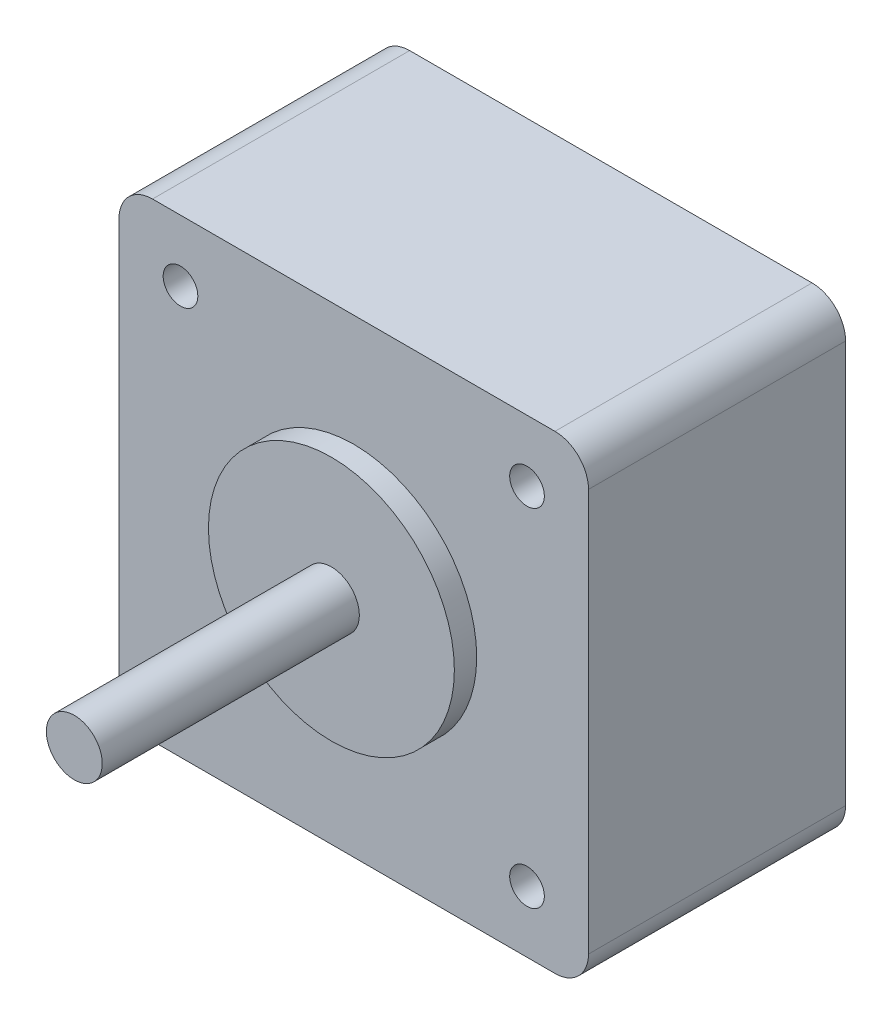
ISO-10303-21;
HEADER;
FILE_DESCRIPTION(('STEP AP214'),'2;1');
FILE_NAME('part.step','',(''),(''),'','','');
FILE_SCHEMA(('AUTOMOTIVE_DESIGN { 1 0 10303 214 1 1 1 1 }'));
ENDSEC;
DATA;
#1=APPLICATION_CONTEXT('core data for automotive mechanical design processes');
#2=APPLICATION_PROTOCOL_DEFINITION('international standard','automotive_design',2000,#1);
#3=PRODUCT_CONTEXT('',#1,'mechanical');
#4=PRODUCT('Part','Part','',(#3));
#5=PRODUCT_RELATED_PRODUCT_CATEGORY('part','',(#4));
#6=PRODUCT_DEFINITION_FORMATION('','',#4);
#7=PRODUCT_DEFINITION_CONTEXT('part definition',#1,'design');
#8=PRODUCT_DEFINITION('design','',#6,#7);
#9=PRODUCT_DEFINITION_SHAPE('','',#8);
#10=(LENGTH_UNIT() NAMED_UNIT(*) SI_UNIT(.MILLI.,.METRE.));
#11=(NAMED_UNIT(*) PLANE_ANGLE_UNIT() SI_UNIT($,.RADIAN.));
#12=(NAMED_UNIT(*) SI_UNIT($,.STERADIAN.) SOLID_ANGLE_UNIT());
#13=UNCERTAINTY_MEASURE_WITH_UNIT(LENGTH_MEASURE(1.E-05),#10,'distance_accuracy_value','');
#14=(GEOMETRIC_REPRESENTATION_CONTEXT(3) GLOBAL_UNCERTAINTY_ASSIGNED_CONTEXT((#13)) GLOBAL_UNIT_ASSIGNED_CONTEXT((#10,
#11,#12)) REPRESENTATION_CONTEXT('',''));
#15=CARTESIAN_POINT('',(0.,0.,0.));
#16=DIRECTION('',(0.,0.,1.));
#17=DIRECTION('',(1.,0.,0.));
#18=AXIS2_PLACEMENT_3D('',#15,#16,#17);
#19=CARTESIAN_POINT('',(-18.,-18.,23.));
#20=DIRECTION('',(0.,0.,-1.));
#21=DIRECTION('',(-1.,0.,0.));
#22=AXIS2_PLACEMENT_3D('',#19,#20,#21);
#23=CYLINDRICAL_SURFACE('',#22,3.);
#24=CARTESIAN_POINT('',(-18.,-18.,0.));
#25=DIRECTION('',(0.,0.,1.));
#26=DIRECTION('',(-1.,0.,0.));
#27=AXIS2_PLACEMENT_3D('',#24,#25,#26);
#28=CIRCLE('',#27,3.);
#29=CARTESIAN_POINT('',(-21.,-18.,0.));
#30=VERTEX_POINT('',#29);
#31=CARTESIAN_POINT('',(-18.,-21.,0.));
#32=VERTEX_POINT('',#31);
#33=EDGE_CURVE('E143',#30,#32,#28,.T.);
#34=ORIENTED_EDGE('',*,*,#33,.T.);
#35=DIRECTION('',(0.,0.,-1.));
#36=VECTOR('',#35,1.);
#37=CARTESIAN_POINT('',(-18.,-21.,23.));
#38=LINE('',#37,#36);
#39=CARTESIAN_POINT('',(-18.,-21.,23.));
#40=VERTEX_POINT('',#39);
#41=EDGE_CURVE('E42',#40,#32,#38,.T.);
#42=ORIENTED_EDGE('',*,*,#41,.F.);
#43=CARTESIAN_POINT('',(-18.,-18.,23.));
#44=DIRECTION('',(0.,0.,1.));
#45=DIRECTION('',(-1.,0.,0.));
#46=AXIS2_PLACEMENT_3D('',#43,#44,#45);
#47=CIRCLE('',#46,3.);
#48=CARTESIAN_POINT('',(-21.,-18.,23.));
#49=VERTEX_POINT('',#48);
#50=EDGE_CURVE('E166',#49,#40,#47,.T.);
#51=ORIENTED_EDGE('',*,*,#50,.F.);
#52=DIRECTION('',(0.,0.,-1.));
#53=VECTOR('',#52,1.);
#54=CARTESIAN_POINT('',(-21.,-18.,23.));
#55=LINE('',#54,#53);
#56=EDGE_CURVE('E139',#49,#30,#55,.T.);
#57=ORIENTED_EDGE('',*,*,#56,.T.);
#58=EDGE_LOOP('',(#34,#42,#51,#57));
#59=FACE_BOUND('',#58,.T.);
#60=ADVANCED_FACE('F39',(#59),#23,.T.);
#61=CARTESIAN_POINT('',(-18.,-21.,23.));
#62=DIRECTION('',(0.,1.,0.));
#63=DIRECTION('',(0.,0.,1.));
#64=AXIS2_PLACEMENT_3D('',#61,#62,#63);
#65=PLANE('',#64);
#66=DIRECTION('',(1.,0.,0.));
#67=VECTOR('',#66,1.);
#68=CARTESIAN_POINT('',(-18.,-21.,0.));
#69=LINE('',#68,#67);
#70=CARTESIAN_POINT('',(18.,-21.,0.));
#71=VERTEX_POINT('',#70);
#72=EDGE_CURVE('E147',#32,#71,#69,.T.);
#73=ORIENTED_EDGE('',*,*,#72,.T.);
#74=DIRECTION('',(0.,0.,-1.));
#75=VECTOR('',#74,1.);
#76=CARTESIAN_POINT('',(18.,-21.,23.));
#77=LINE('',#76,#75);
#78=CARTESIAN_POINT('',(18.,-21.,23.));
#79=VERTEX_POINT('',#78);
#80=EDGE_CURVE('E180',#79,#71,#77,.T.);
#81=ORIENTED_EDGE('',*,*,#80,.F.);
#82=DIRECTION('',(1.,0.,0.));
#83=VECTOR('',#82,1.);
#84=CARTESIAN_POINT('',(-18.,-21.,23.));
#85=LINE('',#84,#83);
#86=EDGE_CURVE('E102',#40,#79,#85,.T.);
#87=ORIENTED_EDGE('',*,*,#86,.F.);
#88=ORIENTED_EDGE('',*,*,#41,.T.);
#89=EDGE_LOOP('',(#73,#81,#87,#88));
#90=FACE_BOUND('',#89,.T.);
#91=ADVANCED_FACE('F277',(#90),#65,.F.);
#92=CARTESIAN_POINT('',(18.,-18.,23.));
#93=DIRECTION('',(0.,0.,-1.));
#94=DIRECTION('',(-1.,0.,0.));
#95=AXIS2_PLACEMENT_3D('',#92,#93,#94);
#96=CYLINDRICAL_SURFACE('',#95,3.);
#97=CARTESIAN_POINT('',(18.,-18.,0.));
#98=DIRECTION('',(0.,0.,1.));
#99=DIRECTION('',(-1.,0.,0.));
#100=AXIS2_PLACEMENT_3D('',#97,#98,#99);
#101=CIRCLE('',#100,3.);
#102=CARTESIAN_POINT('',(21.,-18.,0.));
#103=VERTEX_POINT('',#102);
#104=EDGE_CURVE('E151',#71,#103,#101,.T.);
#105=ORIENTED_EDGE('',*,*,#104,.T.);
#106=DIRECTION('',(0.,0.,-1.));
#107=VECTOR('',#106,1.);
#108=CARTESIAN_POINT('',(21.,-18.,23.));
#109=LINE('',#108,#107);
#110=CARTESIAN_POINT('',(21.,-18.,23.));
#111=VERTEX_POINT('',#110);
#112=EDGE_CURVE('E177',#111,#103,#109,.T.);
#113=ORIENTED_EDGE('',*,*,#112,.F.);
#114=CARTESIAN_POINT('',(18.,-18.,23.));
#115=DIRECTION('',(0.,0.,1.));
#116=DIRECTION('',(-1.,0.,0.));
#117=AXIS2_PLACEMENT_3D('',#114,#115,#116);
#118=CIRCLE('',#117,3.);
#119=EDGE_CURVE('E199',#79,#111,#118,.T.);
#120=ORIENTED_EDGE('',*,*,#119,.F.);
#121=ORIENTED_EDGE('',*,*,#80,.T.);
#122=EDGE_LOOP('',(#105,#113,#120,#121));
#123=FACE_BOUND('',#122,.T.);
#124=ADVANCED_FACE('F282',(#123),#96,.T.);
#125=CARTESIAN_POINT('',(21.,18.,23.));
#126=DIRECTION('',(-1.,0.,0.));
#127=DIRECTION('',(0.,0.,1.));
#128=AXIS2_PLACEMENT_3D('',#125,#126,#127);
#129=PLANE('',#128);
#130=DIRECTION('',(0.,1.,0.));
#131=VECTOR('',#130,1.);
#132=CARTESIAN_POINT('',(21.,18.,0.));
#133=LINE('',#132,#131);
#134=CARTESIAN_POINT('',(21.,18.,0.));
#135=VERTEX_POINT('',#134);
#136=EDGE_CURVE('E154',#103,#135,#133,.T.);
#137=ORIENTED_EDGE('',*,*,#136,.T.);
#138=DIRECTION('',(0.,0.,-1.));
#139=VECTOR('',#138,1.);
#140=CARTESIAN_POINT('',(21.,18.,23.));
#141=LINE('',#140,#139);
#142=CARTESIAN_POINT('',(21.,18.,23.));
#143=VERTEX_POINT('',#142);
#144=EDGE_CURVE('E173',#143,#135,#141,.T.);
#145=ORIENTED_EDGE('',*,*,#144,.F.);
#146=DIRECTION('',(0.,1.,0.));
#147=VECTOR('',#146,1.);
#148=CARTESIAN_POINT('',(21.,18.,23.));
#149=LINE('',#148,#147);
#150=EDGE_CURVE('E202',#111,#143,#149,.T.);
#151=ORIENTED_EDGE('',*,*,#150,.F.);
#152=ORIENTED_EDGE('',*,*,#112,.T.);
#153=EDGE_LOOP('',(#137,#145,#151,#152));
#154=FACE_BOUND('',#153,.T.);
#155=ADVANCED_FACE('F291',(#154),#129,.F.);
#156=CARTESIAN_POINT('',(18.,18.,23.));
#157=DIRECTION('',(0.,0.,-1.));
#158=DIRECTION('',(-1.,0.,0.));
#159=AXIS2_PLACEMENT_3D('',#156,#157,#158);
#160=CYLINDRICAL_SURFACE('',#159,3.);
#161=CARTESIAN_POINT('',(18.,18.,0.));
#162=DIRECTION('',(0.,0.,1.));
#163=DIRECTION('',(-1.,0.,0.));
#164=AXIS2_PLACEMENT_3D('',#161,#162,#163);
#165=CIRCLE('',#164,3.);
#166=CARTESIAN_POINT('',(18.,21.,0.));
#167=VERTEX_POINT('',#166);
#168=EDGE_CURVE('E157',#135,#167,#165,.T.);
#169=ORIENTED_EDGE('',*,*,#168,.T.);
#170=DIRECTION('',(0.,0.,-1.));
#171=VECTOR('',#170,1.);
#172=CARTESIAN_POINT('',(18.,21.,23.));
#173=LINE('',#172,#171);
#174=CARTESIAN_POINT('',(18.,21.,23.));
#175=VERTEX_POINT('',#174);
#176=EDGE_CURVE('E132',#175,#167,#173,.T.);
#177=ORIENTED_EDGE('',*,*,#176,.F.);
#178=CARTESIAN_POINT('',(18.,18.,23.));
#179=DIRECTION('',(0.,0.,1.));
#180=DIRECTION('',(-1.,0.,0.));
#181=AXIS2_PLACEMENT_3D('',#178,#179,#180);
#182=CIRCLE('',#181,3.);
#183=EDGE_CURVE('E121',#143,#175,#182,.T.);
#184=ORIENTED_EDGE('',*,*,#183,.F.);
#185=ORIENTED_EDGE('',*,*,#144,.T.);
#186=EDGE_LOOP('',(#169,#177,#184,#185));
#187=FACE_BOUND('',#186,.T.);
#188=ADVANCED_FACE('F294',(#187),#160,.T.);
#189=CARTESIAN_POINT('',(-18.,21.,23.));
#190=DIRECTION('',(0.,-1.,0.));
#191=DIRECTION('',(0.,0.,-1.));
#192=AXIS2_PLACEMENT_3D('',#189,#190,#191);
#193=PLANE('',#192);
#194=DIRECTION('',(-1.,0.,0.));
#195=VECTOR('',#194,1.);
#196=CARTESIAN_POINT('',(-18.,21.,0.));
#197=LINE('',#196,#195);
#198=CARTESIAN_POINT('',(-18.,21.,0.));
#199=VERTEX_POINT('',#198);
#200=EDGE_CURVE('E130',#167,#199,#197,.T.);
#201=ORIENTED_EDGE('',*,*,#200,.T.);
#202=DIRECTION('',(0.,0.,-1.));
#203=VECTOR('',#202,1.);
#204=CARTESIAN_POINT('',(-18.,21.,23.));
#205=LINE('',#204,#203);
#206=CARTESIAN_POINT('',(-18.,21.,23.));
#207=VERTEX_POINT('',#206);
#208=EDGE_CURVE('E127',#207,#199,#205,.T.);
#209=ORIENTED_EDGE('',*,*,#208,.F.);
#210=DIRECTION('',(-1.,0.,0.));
#211=VECTOR('',#210,1.);
#212=CARTESIAN_POINT('',(-18.,21.,23.));
#213=LINE('',#212,#211);
#214=EDGE_CURVE('E115',#175,#207,#213,.T.);
#215=ORIENTED_EDGE('',*,*,#214,.F.);
#216=ORIENTED_EDGE('',*,*,#176,.T.);
#217=EDGE_LOOP('',(#201,#209,#215,#216));
#218=FACE_BOUND('',#217,.T.);
#219=ADVANCED_FACE('F128',(#218),#193,.F.);
#220=CARTESIAN_POINT('',(-18.,18.,23.));
#221=DIRECTION('',(0.,0.,-1.));
#222=DIRECTION('',(-1.,0.,0.));
#223=AXIS2_PLACEMENT_3D('',#220,#221,#222);
#224=CYLINDRICAL_SURFACE('',#223,3.);
#225=CARTESIAN_POINT('',(-18.,18.,0.));
#226=DIRECTION('',(0.,0.,1.));
#227=DIRECTION('',(-1.,0.,0.));
#228=AXIS2_PLACEMENT_3D('',#225,#226,#227);
#229=CIRCLE('',#228,3.);
#230=CARTESIAN_POINT('',(-21.,18.,0.));
#231=VERTEX_POINT('',#230);
#232=EDGE_CURVE('E87',#199,#231,#229,.T.);
#233=ORIENTED_EDGE('',*,*,#232,.T.);
#234=DIRECTION('',(0.,0.,-1.));
#235=VECTOR('',#234,1.);
#236=CARTESIAN_POINT('',(-21.,18.,23.));
#237=LINE('',#236,#235);
#238=CARTESIAN_POINT('',(-21.,18.,23.));
#239=VERTEX_POINT('',#238);
#240=EDGE_CURVE('E133',#239,#231,#237,.T.);
#241=ORIENTED_EDGE('',*,*,#240,.F.);
#242=CARTESIAN_POINT('',(-18.,18.,23.));
#243=DIRECTION('',(0.,0.,1.));
#244=DIRECTION('',(-1.,0.,0.));
#245=AXIS2_PLACEMENT_3D('',#242,#243,#244);
#246=CIRCLE('',#245,3.);
#247=EDGE_CURVE('E119',#207,#239,#246,.T.);
#248=ORIENTED_EDGE('',*,*,#247,.F.);
#249=ORIENTED_EDGE('',*,*,#208,.T.);
#250=EDGE_LOOP('',(#233,#241,#248,#249));
#251=FACE_BOUND('',#250,.T.);
#252=ADVANCED_FACE('F135',(#251),#224,.T.);
#253=CARTESIAN_POINT('',(-21.,18.,23.));
#254=DIRECTION('',(1.,0.,0.));
#255=DIRECTION('',(0.,1.,0.));
#256=AXIS2_PLACEMENT_3D('',#253,#254,#255);
#257=PLANE('',#256);
#258=DIRECTION('',(0.,-1.,0.));
#259=VECTOR('',#258,1.);
#260=CARTESIAN_POINT('',(-21.,18.,0.));
#261=LINE('',#260,#259);
#262=EDGE_CURVE('E93',#231,#30,#261,.T.);
#263=ORIENTED_EDGE('',*,*,#262,.T.);
#264=ORIENTED_EDGE('',*,*,#56,.F.);
#265=DIRECTION('',(0.,-1.,0.));
#266=VECTOR('',#265,1.);
#267=CARTESIAN_POINT('',(-21.,18.,23.));
#268=LINE('',#267,#266);
#269=EDGE_CURVE('E58',#239,#49,#268,.T.);
#270=ORIENTED_EDGE('',*,*,#269,.F.);
#271=ORIENTED_EDGE('',*,*,#240,.T.);
#272=EDGE_LOOP('',(#263,#264,#270,#271));
#273=FACE_BOUND('',#272,.T.);
#274=ADVANCED_FACE('F250',(#273),#257,.F.);
#275=CARTESIAN_POINT('',(-18.,-18.,23.));
#276=DIRECTION('',(0.,0.,-1.));
#277=DIRECTION('',(-1.,0.,0.));
#278=AXIS2_PLACEMENT_3D('',#275,#276,#277);
#279=PLANE('',#278);
#280=CARTESIAN_POINT('',(-15.5,-15.5,23.));
#281=DIRECTION('',(0.,0.,1.));
#282=DIRECTION('',(1.,0.,0.));
#283=AXIS2_PLACEMENT_3D('',#280,#281,#282);
#284=CIRCLE('',#283,1.55);
#285=CARTESIAN_POINT('',(-13.95,-15.5,23.));
#286=VERTEX_POINT('',#285);
#287=EDGE_CURVE('E239',#286,#286,#284,.T.);
#288=ORIENTED_EDGE('',*,*,#287,.F.);
#289=EDGE_LOOP('',(#288));
#290=FACE_BOUND('',#289,.T.);
#291=CARTESIAN_POINT('',(15.5,-15.5,23.));
#292=DIRECTION('',(0.,0.,1.));
#293=DIRECTION('',(1.,0.,0.));
#294=AXIS2_PLACEMENT_3D('',#291,#292,#293);
#295=CIRCLE('',#294,1.55);
#296=CARTESIAN_POINT('',(17.05,-15.5,23.));
#297=VERTEX_POINT('',#296);
#298=EDGE_CURVE('E231',#297,#297,#295,.T.);
#299=ORIENTED_EDGE('',*,*,#298,.F.);
#300=EDGE_LOOP('',(#299));
#301=FACE_BOUND('',#300,.T.);
#302=CARTESIAN_POINT('',(15.5,15.5,23.));
#303=DIRECTION('',(0.,0.,1.));
#304=DIRECTION('',(1.,0.,0.));
#305=AXIS2_PLACEMENT_3D('',#302,#303,#304);
#306=CIRCLE('',#305,1.55);
#307=CARTESIAN_POINT('',(17.05,15.5,23.));
#308=VERTEX_POINT('',#307);
#309=EDGE_CURVE('E223',#308,#308,#306,.T.);
#310=ORIENTED_EDGE('',*,*,#309,.F.);
#311=EDGE_LOOP('',(#310));
#312=FACE_BOUND('',#311,.T.);
#313=CARTESIAN_POINT('',(-15.5,15.5,23.));
#314=DIRECTION('',(0.,0.,1.));
#315=DIRECTION('',(1.,0.,0.));
#316=AXIS2_PLACEMENT_3D('',#313,#314,#315);
#317=CIRCLE('',#316,1.55);
#318=CARTESIAN_POINT('',(-13.95,15.5,23.));
#319=VERTEX_POINT('',#318);
#320=EDGE_CURVE('E215',#319,#319,#317,.T.);
#321=ORIENTED_EDGE('',*,*,#320,.F.);
#322=EDGE_LOOP('',(#321));
#323=FACE_BOUND('',#322,.T.);
#324=CARTESIAN_POINT('',(0.,0.,23.));
#325=DIRECTION('',(0.,0.,1.));
#326=DIRECTION('',(1.,0.,0.));
#327=AXIS2_PLACEMENT_3D('',#324,#325,#326);
#328=CIRCLE('',#327,11.);
#329=CARTESIAN_POINT('',(11.,0.,23.));
#330=VERTEX_POINT('',#329);
#331=EDGE_CURVE('E49',#330,#330,#328,.T.);
#332=ORIENTED_EDGE('',*,*,#331,.F.);
#333=EDGE_LOOP('',(#332));
#334=FACE_BOUND('',#333,.T.);
#335=ORIENTED_EDGE('',*,*,#50,.T.);
#336=ORIENTED_EDGE('',*,*,#86,.T.);
#337=ORIENTED_EDGE('',*,*,#119,.T.);
#338=ORIENTED_EDGE('',*,*,#150,.T.);
#339=ORIENTED_EDGE('',*,*,#183,.T.);
#340=ORIENTED_EDGE('',*,*,#214,.T.);
#341=ORIENTED_EDGE('',*,*,#247,.T.);
#342=ORIENTED_EDGE('',*,*,#269,.T.);
#343=EDGE_LOOP('',(#335,#336,#337,#338,#339,#340,#341,#342));
#344=FACE_BOUND('',#343,.T.);
#345=ADVANCED_FACE('F117',(#290,#301,#312,#323,#334,#344),#279,.F.);
#346=CARTESIAN_POINT('',(-18.,-18.,0.));
#347=DIRECTION('',(0.,0.,-1.));
#348=DIRECTION('',(-1.,0.,0.));
#349=AXIS2_PLACEMENT_3D('',#346,#347,#348);
#350=PLANE('',#349);
#351=ORIENTED_EDGE('',*,*,#33,.F.);
#352=ORIENTED_EDGE('',*,*,#262,.F.);
#353=ORIENTED_EDGE('',*,*,#232,.F.);
#354=ORIENTED_EDGE('',*,*,#200,.F.);
#355=ORIENTED_EDGE('',*,*,#168,.F.);
#356=ORIENTED_EDGE('',*,*,#136,.F.);
#357=ORIENTED_EDGE('',*,*,#104,.F.);
#358=ORIENTED_EDGE('',*,*,#72,.F.);
#359=EDGE_LOOP('',(#351,#352,#353,#354,#355,#356,#357,#358));
#360=FACE_BOUND('',#359,.T.);
#361=ADVANCED_FACE('F249',(#360),#350,.T.);
#362=CARTESIAN_POINT('',(0.,0.,25.));
#363=DIRECTION('',(0.,0.,-1.));
#364=DIRECTION('',(-1.,0.,0.));
#365=AXIS2_PLACEMENT_3D('',#362,#363,#364);
#366=CYLINDRICAL_SURFACE('',#365,11.);
#367=CARTESIAN_POINT('',(0.,0.,25.));
#368=DIRECTION('',(0.,0.,1.));
#369=DIRECTION('',(1.,0.,0.));
#370=AXIS2_PLACEMENT_3D('',#367,#368,#369);
#371=CIRCLE('',#370,11.);
#372=CARTESIAN_POINT('',(11.,0.,25.));
#373=VERTEX_POINT('',#372);
#374=EDGE_CURVE('E148',#373,#373,#371,.T.);
#375=ORIENTED_EDGE('',*,*,#374,.F.);
#376=EDGE_LOOP('',(#375));
#377=FACE_BOUND('',#376,.T.);
#378=ORIENTED_EDGE('',*,*,#331,.T.);
#379=EDGE_LOOP('',(#378));
#380=FACE_BOUND('',#379,.T.);
#381=ADVANCED_FACE('F349',(#377,#380),#366,.T.);
#382=CARTESIAN_POINT('',(0.,0.,25.));
#383=DIRECTION('',(0.,0.,1.));
#384=DIRECTION('',(1.,0.,0.));
#385=AXIS2_PLACEMENT_3D('',#382,#383,#384);
#386=PLANE('',#385);
#387=CARTESIAN_POINT('',(0.,0.,25.));
#388=DIRECTION('',(0.,0.,1.));
#389=DIRECTION('',(1.,0.,0.));
#390=AXIS2_PLACEMENT_3D('',#387,#388,#389);
#391=CIRCLE('',#390,2.5);
#392=CARTESIAN_POINT('',(2.5,0.,25.));
#393=VERTEX_POINT('',#392);
#394=EDGE_CURVE('E11',#393,#393,#391,.T.);
#395=ORIENTED_EDGE('',*,*,#394,.F.);
#396=EDGE_LOOP('',(#395));
#397=FACE_BOUND('',#396,.T.);
#398=ORIENTED_EDGE('',*,*,#374,.T.);
#399=EDGE_LOOP('',(#398));
#400=FACE_BOUND('',#399,.T.);
#401=ADVANCED_FACE('F358',(#397,#400),#386,.T.);
#402=CARTESIAN_POINT('',(0.,0.,48.));
#403=DIRECTION('',(0.,0.,-1.));
#404=DIRECTION('',(-1.,0.,0.));
#405=AXIS2_PLACEMENT_3D('',#402,#403,#404);
#406=CYLINDRICAL_SURFACE('',#405,2.5);
#407=CARTESIAN_POINT('',(0.,0.,48.));
#408=DIRECTION('',(0.,0.,1.));
#409=DIRECTION('',(1.,0.,0.));
#410=AXIS2_PLACEMENT_3D('',#407,#408,#409);
#411=CIRCLE('',#410,2.5);
#412=CARTESIAN_POINT('',(2.5,0.,48.));
#413=VERTEX_POINT('',#412);
#414=EDGE_CURVE('E208',#413,#413,#411,.T.);
#415=ORIENTED_EDGE('',*,*,#414,.F.);
#416=EDGE_LOOP('',(#415));
#417=FACE_BOUND('',#416,.T.);
#418=ORIENTED_EDGE('',*,*,#394,.T.);
#419=EDGE_LOOP('',(#418));
#420=FACE_BOUND('',#419,.T.);
#421=ADVANCED_FACE('F272',(#417,#420),#406,.T.);
#422=CARTESIAN_POINT('',(0.,0.,48.));
#423=DIRECTION('',(0.,0.,1.));
#424=DIRECTION('',(1.,0.,0.));
#425=AXIS2_PLACEMENT_3D('',#422,#423,#424);
#426=PLANE('',#425);
#427=ORIENTED_EDGE('',*,*,#414,.T.);
#428=EDGE_LOOP('',(#427));
#429=FACE_BOUND('',#428,.T.);
#430=ADVANCED_FACE('F262',(#429),#426,.T.);
#431=CARTESIAN_POINT('',(-15.5,15.5,18.));
#432=DIRECTION('',(0.,0.,1.));
#433=DIRECTION('',(1.,0.,0.));
#434=AXIS2_PLACEMENT_3D('',#431,#432,#433);
#435=CYLINDRICAL_SURFACE('',#434,1.55);
#436=CARTESIAN_POINT('',(-15.5,15.5,18.));
#437=DIRECTION('',(0.,0.,1.));
#438=DIRECTION('',(1.,0.,0.));
#439=AXIS2_PLACEMENT_3D('',#436,#437,#438);
#440=CIRCLE('',#439,1.55);
#441=CARTESIAN_POINT('',(-13.95,15.5,18.));
#442=VERTEX_POINT('',#441);
#443=EDGE_CURVE('E211',#442,#442,#440,.T.);
#444=ORIENTED_EDGE('',*,*,#443,.F.);
#445=EDGE_LOOP('',(#444));
#446=FACE_BOUND('',#445,.T.);
#447=ORIENTED_EDGE('',*,*,#320,.T.);
#448=EDGE_LOOP('',(#447));
#449=FACE_BOUND('',#448,.T.);
#450=ADVANCED_FACE('F259',(#446,#449),#435,.F.);
#451=CARTESIAN_POINT('',(-15.5,15.5,18.));
#452=DIRECTION('',(0.,0.,1.));
#453=DIRECTION('',(1.,0.,0.));
#454=AXIS2_PLACEMENT_3D('',#451,#452,#453);
#455=PLANE('',#454);
#456=ORIENTED_EDGE('',*,*,#443,.T.);
#457=EDGE_LOOP('',(#456));
#458=FACE_BOUND('',#457,.T.);
#459=ADVANCED_FACE('F261',(#458),#455,.T.);
#460=CARTESIAN_POINT('',(15.5,15.5,18.));
#461=DIRECTION('',(0.,0.,1.));
#462=DIRECTION('',(1.,0.,0.));
#463=AXIS2_PLACEMENT_3D('',#460,#461,#462);
#464=CYLINDRICAL_SURFACE('',#463,1.55);
#465=CARTESIAN_POINT('',(15.5,15.5,18.));
#466=DIRECTION('',(0.,0.,1.));
#467=DIRECTION('',(1.,0.,0.));
#468=AXIS2_PLACEMENT_3D('',#465,#466,#467);
#469=CIRCLE('',#468,1.55);
#470=CARTESIAN_POINT('',(17.05,15.5,18.));
#471=VERTEX_POINT('',#470);
#472=EDGE_CURVE('E219',#471,#471,#469,.T.);
#473=ORIENTED_EDGE('',*,*,#472,.F.);
#474=EDGE_LOOP('',(#473));
#475=FACE_BOUND('',#474,.T.);
#476=ORIENTED_EDGE('',*,*,#309,.T.);
#477=EDGE_LOOP('',(#476));
#478=FACE_BOUND('',#477,.T.);
#479=ADVANCED_FACE('F269',(#475,#478),#464,.F.);
#480=CARTESIAN_POINT('',(15.5,15.5,18.));
#481=DIRECTION('',(0.,0.,1.));
#482=DIRECTION('',(1.,0.,0.));
#483=AXIS2_PLACEMENT_3D('',#480,#481,#482);
#484=PLANE('',#483);
#485=ORIENTED_EDGE('',*,*,#472,.T.);
#486=EDGE_LOOP('',(#485));
#487=FACE_BOUND('',#486,.T.);
#488=ADVANCED_FACE('F407',(#487),#484,.T.);
#489=CARTESIAN_POINT('',(15.5,-15.5,18.));
#490=DIRECTION('',(0.,0.,1.));
#491=DIRECTION('',(1.,0.,0.));
#492=AXIS2_PLACEMENT_3D('',#489,#490,#491);
#493=CYLINDRICAL_SURFACE('',#492,1.55);
#494=CARTESIAN_POINT('',(15.5,-15.5,18.));
#495=DIRECTION('',(0.,0.,1.));
#496=DIRECTION('',(1.,0.,0.));
#497=AXIS2_PLACEMENT_3D('',#494,#495,#496);
#498=CIRCLE('',#497,1.55);
#499=CARTESIAN_POINT('',(17.05,-15.5,18.));
#500=VERTEX_POINT('',#499);
#501=EDGE_CURVE('E227',#500,#500,#498,.T.);
#502=ORIENTED_EDGE('',*,*,#501,.F.);
#503=EDGE_LOOP('',(#502));
#504=FACE_BOUND('',#503,.T.);
#505=ORIENTED_EDGE('',*,*,#298,.T.);
#506=EDGE_LOOP('',(#505));
#507=FACE_BOUND('',#506,.T.);
#508=ADVANCED_FACE('F417',(#504,#507),#493,.F.);
#509=CARTESIAN_POINT('',(15.5,-15.5,18.));
#510=DIRECTION('',(0.,0.,1.));
#511=DIRECTION('',(1.,0.,0.));
#512=AXIS2_PLACEMENT_3D('',#509,#510,#511);
#513=PLANE('',#512);
#514=ORIENTED_EDGE('',*,*,#501,.T.);
#515=EDGE_LOOP('',(#514));
#516=FACE_BOUND('',#515,.T.);
#517=ADVANCED_FACE('F427',(#516),#513,.T.);
#518=CARTESIAN_POINT('',(-15.5,-15.5,18.));
#519=DIRECTION('',(0.,0.,1.));
#520=DIRECTION('',(1.,0.,0.));
#521=AXIS2_PLACEMENT_3D('',#518,#519,#520);
#522=CYLINDRICAL_SURFACE('',#521,1.55);
#523=CARTESIAN_POINT('',(-15.5,-15.5,18.));
#524=DIRECTION('',(0.,0.,1.));
#525=DIRECTION('',(1.,0.,0.));
#526=AXIS2_PLACEMENT_3D('',#523,#524,#525);
#527=CIRCLE('',#526,1.55);
#528=CARTESIAN_POINT('',(-13.95,-15.5,18.));
#529=VERTEX_POINT('',#528);
#530=EDGE_CURVE('E235',#529,#529,#527,.T.);
#531=ORIENTED_EDGE('',*,*,#530,.F.);
#532=EDGE_LOOP('',(#531));
#533=FACE_BOUND('',#532,.T.);
#534=ORIENTED_EDGE('',*,*,#287,.T.);
#535=EDGE_LOOP('',(#534));
#536=FACE_BOUND('',#535,.T.);
#537=ADVANCED_FACE('F245',(#533,#536),#522,.F.);
#538=CARTESIAN_POINT('',(-15.5,-15.5,18.));
#539=DIRECTION('',(0.,0.,1.));
#540=DIRECTION('',(1.,0.,0.));
#541=AXIS2_PLACEMENT_3D('',#538,#539,#540);
#542=PLANE('',#541);
#543=ORIENTED_EDGE('',*,*,#530,.T.);
#544=EDGE_LOOP('',(#543));
#545=FACE_BOUND('',#544,.T.);
#546=ADVANCED_FACE('F446',(#545),#542,.T.);
#547=CLOSED_SHELL('',(#60,#91,#124,#155,#188,#219,#252,#274,#345,#361,#381,#401,#421,#430,#450,
#459,#479,#488,#508,#517,#537,#546));
#548=MANIFOLD_SOLID_BREP('B2',#547);
#549=ADVANCED_BREP_SHAPE_REPRESENTATION('',(#18,#548),#14);
#550=SHAPE_DEFINITION_REPRESENTATION(#9,#549);
ENDSEC;
END-ISO-10303-21;
